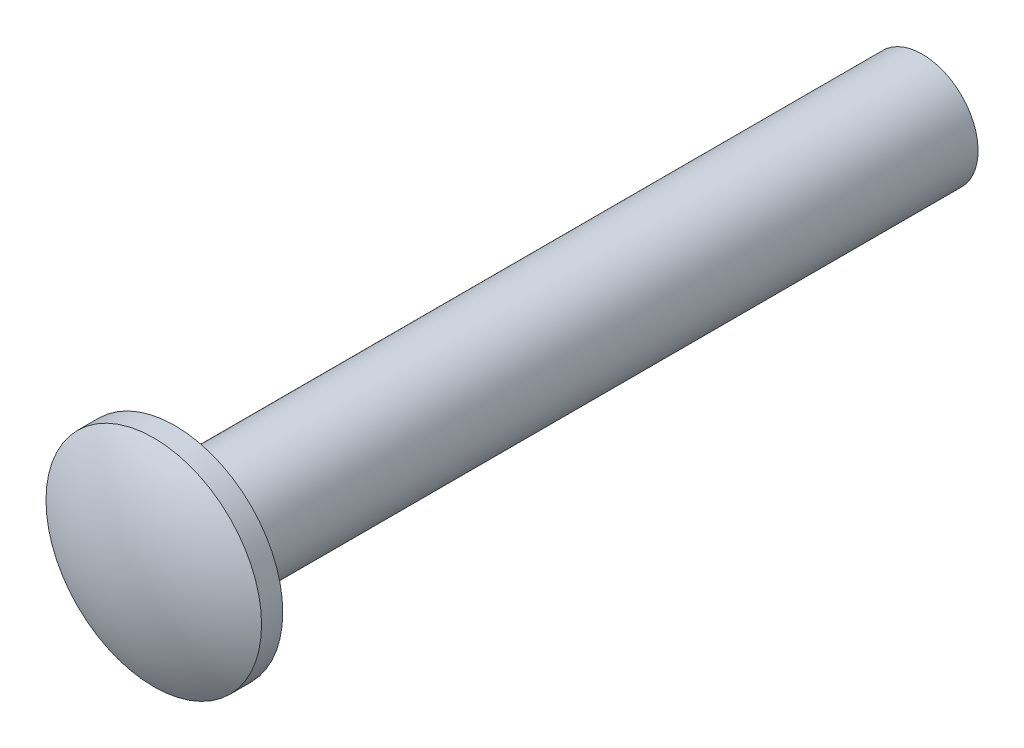
ISO-10303-21;
HEADER;
FILE_DESCRIPTION(('STEP AP214'),'2;1');
FILE_NAME('part.step','',(''),(''),'','','');
FILE_SCHEMA(('AUTOMOTIVE_DESIGN { 1 0 10303 214 1 1 1 1 }'));
ENDSEC;
DATA;
#1=APPLICATION_CONTEXT('core data for automotive mechanical design processes');
#2=APPLICATION_PROTOCOL_DEFINITION('international standard','automotive_design',2000,#1);
#3=PRODUCT_CONTEXT('',#1,'mechanical');
#4=PRODUCT('Part','Part','',(#3));
#5=PRODUCT_RELATED_PRODUCT_CATEGORY('part','',(#4));
#6=PRODUCT_DEFINITION_FORMATION('','',#4);
#7=PRODUCT_DEFINITION_CONTEXT('part definition',#1,'design');
#8=PRODUCT_DEFINITION('design','',#6,#7);
#9=PRODUCT_DEFINITION_SHAPE('','',#8);
#10=(LENGTH_UNIT() NAMED_UNIT(*) SI_UNIT(.MILLI.,.METRE.));
#11=(NAMED_UNIT(*) PLANE_ANGLE_UNIT() SI_UNIT($,.RADIAN.));
#12=(NAMED_UNIT(*) SI_UNIT($,.STERADIAN.) SOLID_ANGLE_UNIT());
#13=UNCERTAINTY_MEASURE_WITH_UNIT(LENGTH_MEASURE(1.E-05),#10,'distance_accuracy_value','');
#14=(GEOMETRIC_REPRESENTATION_CONTEXT(3) GLOBAL_UNCERTAINTY_ASSIGNED_CONTEXT((#13)) GLOBAL_UNIT_ASSIGNED_CONTEXT((#10,
#11,#12)) REPRESENTATION_CONTEXT('',''));
#15=CARTESIAN_POINT('',(0.,0.,0.));
#16=DIRECTION('',(0.,0.,1.));
#17=DIRECTION('',(1.,0.,0.));
#18=AXIS2_PLACEMENT_3D('',#15,#16,#17);
#19=CARTESIAN_POINT('',(0.,0.,0.9652));
#20=DIRECTION('',(0.,0.,-1.));
#21=DIRECTION('',(-1.,0.,0.));
#22=AXIS2_PLACEMENT_3D('',#19,#20,#21);
#23=CYLINDRICAL_SURFACE('',#22,4.90855);
#24=CARTESIAN_POINT('',(0.,0.,0.9652));
#25=DIRECTION('',(0.,0.,1.));
#26=DIRECTION('',(1.,0.,0.));
#27=AXIS2_PLACEMENT_3D('',#24,#25,#26);
#28=CIRCLE('',#27,4.90855);
#29=CARTESIAN_POINT('',(-4.90855,0.,0.9652));
#30=VERTEX_POINT('',#29);
#31=EDGE_CURVE('E36',#30,#30,#28,.T.);
#32=CARTESIAN_POINT('',(0.,0.,0.));
#33=DIRECTION('',(0.,0.,1.));
#34=DIRECTION('',(1.,0.,0.));
#35=AXIS2_PLACEMENT_3D('',#32,#33,#34);
#36=CIRCLE('',#35,4.90855);
#37=CARTESIAN_POINT('',(-4.90855,0.,0.));
#38=VERTEX_POINT('',#37);
#39=EDGE_CURVE('E44',#38,#38,#36,.T.);
#40=CARTESIAN_POINT('',(-4.90855,0.,0.9652));
#41=CARTESIAN_POINT('',(-4.90855,0.,0.955145833333333));
#42=CARTESIAN_POINT('',(-4.90855,0.,0.945091666666667));
#43=CARTESIAN_POINT('',(-4.90855,0.,0.924983333333333));
#44=CARTESIAN_POINT('',(-4.90855,0.,0.914929166666667));
#45=CARTESIAN_POINT('',(-4.90855,0.,0.894820833333333));
#46=CARTESIAN_POINT('',(-4.90855,0.,0.884766666666667));
#47=CARTESIAN_POINT('',(-4.90855,0.,0.864658333333333));
#48=CARTESIAN_POINT('',(-4.90855,0.,0.854604166666667));
#49=CARTESIAN_POINT('',(-4.90855,0.,0.834495833333333));
#50=CARTESIAN_POINT('',(-4.90855,0.,0.824441666666667));
#51=CARTESIAN_POINT('',(-4.90855,0.,0.804333333333333));
#52=CARTESIAN_POINT('',(-4.90855,0.,0.794279166666667));
#53=CARTESIAN_POINT('',(-4.90855,0.,0.774170833333333));
#54=CARTESIAN_POINT('',(-4.90855,0.,0.764116666666667));
#55=CARTESIAN_POINT('',(-4.90855,0.,0.744008333333333));
#56=CARTESIAN_POINT('',(-4.90855,0.,0.733954166666667));
#57=CARTESIAN_POINT('',(-4.90855,0.,0.713845833333333));
#58=CARTESIAN_POINT('',(-4.90855,0.,0.703791666666667));
#59=CARTESIAN_POINT('',(-4.90855,0.,0.683683333333333));
#60=CARTESIAN_POINT('',(-4.90855,0.,0.673629166666667));
#61=CARTESIAN_POINT('',(-4.90855,0.,0.653520833333333));
#62=CARTESIAN_POINT('',(-4.90855,0.,0.643466666666667));
#63=CARTESIAN_POINT('',(-4.90855,0.,0.623358333333333));
#64=CARTESIAN_POINT('',(-4.90855,0.,0.613304166666667));
#65=CARTESIAN_POINT('',(-4.90855,0.,0.593195833333333));
#66=CARTESIAN_POINT('',(-4.90855,0.,0.583141666666667));
#67=CARTESIAN_POINT('',(-4.90855,0.,0.563033333333333));
#68=CARTESIAN_POINT('',(-4.90855,0.,0.552979166666667));
#69=CARTESIAN_POINT('',(-4.90855,0.,0.532870833333333));
#70=CARTESIAN_POINT('',(-4.90855,0.,0.522816666666667));
#71=CARTESIAN_POINT('',(-4.90855,0.,0.502708333333333));
#72=CARTESIAN_POINT('',(-4.90855,0.,0.492654166666667));
#73=CARTESIAN_POINT('',(-4.90855,0.,0.472545833333333));
#74=CARTESIAN_POINT('',(-4.90855,0.,0.462491666666667));
#75=CARTESIAN_POINT('',(-4.90855,0.,0.442383333333333));
#76=CARTESIAN_POINT('',(-4.90855,0.,0.432329166666667));
#77=CARTESIAN_POINT('',(-4.90855,0.,0.412220833333333));
#78=CARTESIAN_POINT('',(-4.90855,0.,0.402166666666667));
#79=CARTESIAN_POINT('',(-4.90855,0.,0.382058333333333));
#80=CARTESIAN_POINT('',(-4.90855,0.,0.372004166666667));
#81=CARTESIAN_POINT('',(-4.90855,0.,0.351895833333333));
#82=CARTESIAN_POINT('',(-4.90855,0.,0.341841666666667));
#83=CARTESIAN_POINT('',(-4.90855,0.,0.321733333333333));
#84=CARTESIAN_POINT('',(-4.90855,0.,0.311679166666667));
#85=CARTESIAN_POINT('',(-4.90855,0.,0.291570833333333));
#86=CARTESIAN_POINT('',(-4.90855,0.,0.281516666666667));
#87=CARTESIAN_POINT('',(-4.90855,0.,0.261408333333333));
#88=CARTESIAN_POINT('',(-4.90855,0.,0.251354166666667));
#89=CARTESIAN_POINT('',(-4.90855,0.,0.231245833333333));
#90=CARTESIAN_POINT('',(-4.90855,0.,0.221191666666667));
#91=CARTESIAN_POINT('',(-4.90855,0.,0.201083333333333));
#92=CARTESIAN_POINT('',(-4.90855,0.,0.191029166666667));
#93=CARTESIAN_POINT('',(-4.90855,0.,0.170920833333333));
#94=CARTESIAN_POINT('',(-4.90855,0.,0.160866666666667));
#95=CARTESIAN_POINT('',(-4.90855,0.,0.140758333333333));
#96=CARTESIAN_POINT('',(-4.90855,0.,0.130704166666667));
#97=CARTESIAN_POINT('',(-4.90855,0.,0.110595833333333));
#98=CARTESIAN_POINT('',(-4.90855,0.,0.100541666666667));
#99=CARTESIAN_POINT('',(-4.90855,0.,0.0804333333333334));
#100=CARTESIAN_POINT('',(-4.90855,0.,0.0703791666666667));
#101=CARTESIAN_POINT('',(-4.90855,0.,0.0502708333333333));
#102=CARTESIAN_POINT('',(-4.90855,0.,0.0402166666666666));
#103=CARTESIAN_POINT('',(-4.90855,0.,0.0201083333333333));
#104=CARTESIAN_POINT('',(-4.90855,0.,0.0100541666666667));
#105=CARTESIAN_POINT('',(-4.90855,0.,0.));
#106=B_SPLINE_CURVE_WITH_KNOTS('',3,(#40,#41,#42,#43,#44,#45,#46,#47,#48,#49,#50,#51,#52,#53,
#54,#55,#56,#57,#58,#59,#60,#61,#62,#63,#64,#65,#66,#67,#68,#69,#70,#71,#72,#73,#74,#75,#76,#77,
#78,#79,#80,#81,#82,#83,#84,#85,#86,#87,#88,#89,#90,#91,#92,#93,#94,#95,#96,#97,#98,#99,#100,
#101,#102,#103,#104,#105),.UNSPECIFIED.,.F.,.F.,(4,2,2,2,2,2,2,2,2,2,2,2,2,2,2,2,2,2,2,2,2,2,2,
2,2,2,2,2,2,2,2,2,4),(0.,0.0301625000000001,0.0603250000000001,0.0904875000000001,0.12065,
0.1508125,0.180975,0.2111375,0.2413,0.2714625,0.301625,0.3317875,0.36195,0.3921125,0.422275,
0.4524375,0.4826,0.5127625,0.542925,0.5730875,0.60325,0.6334125,0.663575,0.6937375,0.7239,
0.7540625,0.784225,0.8143875,0.84455,0.8747125,0.904875,0.9350375,0.9652),.UNSPECIFIED.);
#107=EDGE_CURVE('BSEAM32',#30,#38,#106,.T.);
#108=ORIENTED_EDGE('',*,*,#31,.F.);
#109=ORIENTED_EDGE('',*,*,#39,.T.);
#110=ORIENTED_EDGE('',*,*,#107,.T.);
#111=ORIENTED_EDGE('',*,*,#107,.F.);
#112=EDGE_LOOP('',(#108,#110,#109,#111));
#113=FACE_BOUND('',#112,.T.);
#114=ADVANCED_FACE('F32',(#113),#23,.T.);
#115=CARTESIAN_POINT('',(0.,0.,-7.49533545673077));
#116=DIRECTION('',(0.,0.,1.));
#117=DIRECTION('',(1.,0.,0.));
#118=AXIS2_PLACEMENT_3D('',#115,#116,#117);
#119=SPHERICAL_SURFACE('',#118,9.78133545673077);
#120=ORIENTED_EDGE('',*,*,#31,.T.);
#121=EDGE_LOOP('',(#120));
#122=FACE_BOUND('',#121,.T.);
#123=ADVANCED_FACE('F34',(#122),#119,.T.);
#124=CARTESIAN_POINT('',(0.,0.,0.));
#125=DIRECTION('',(0.,0.,1.));
#126=DIRECTION('',(1.,0.,0.));
#127=AXIS2_PLACEMENT_3D('',#124,#125,#126);
#128=PLANE('',#127);
#129=CARTESIAN_POINT('',(0.,0.,0.));
#130=DIRECTION('',(0.,0.,-1.));
#131=DIRECTION('',(-1.,0.,0.));
#132=AXIS2_PLACEMENT_3D('',#129,#130,#131);
#133=CIRCLE('',#132,2.54);
#134=CARTESIAN_POINT('',(-2.54,0.,0.));
#135=VERTEX_POINT('',#134);
#136=EDGE_CURVE('E10',#135,#135,#133,.T.);
#137=ORIENTED_EDGE('',*,*,#136,.F.);
#138=EDGE_LOOP('',(#137));
#139=FACE_BOUND('',#138,.T.);
#140=ORIENTED_EDGE('',*,*,#39,.F.);
#141=EDGE_LOOP('',(#140));
#142=FACE_BOUND('',#141,.T.);
#143=ADVANCED_FACE('F57',(#139,#142),#128,.F.);
#144=CARTESIAN_POINT('',(0.,0.,-34.036));
#145=DIRECTION('',(0.,0.,1.));
#146=DIRECTION('',(1.,0.,0.));
#147=AXIS2_PLACEMENT_3D('',#144,#145,#146);
#148=CYLINDRICAL_SURFACE('',#147,2.54);
#149=CARTESIAN_POINT('',(0.,0.,-34.036));
#150=DIRECTION('',(0.,0.,-1.));
#151=DIRECTION('',(-1.,0.,0.));
#152=AXIS2_PLACEMENT_3D('',#149,#150,#151);
#153=CIRCLE('',#152,2.54);
#154=CARTESIAN_POINT('',(-2.54,0.,-34.036));
#155=VERTEX_POINT('',#154);
#156=EDGE_CURVE('E46',#155,#155,#153,.T.);
#157=ORIENTED_EDGE('',*,*,#156,.F.);
#158=EDGE_LOOP('',(#157));
#159=FACE_BOUND('',#158,.T.);
#160=ORIENTED_EDGE('',*,*,#136,.T.);
#161=EDGE_LOOP('',(#160));
#162=FACE_BOUND('',#161,.T.);
#163=ADVANCED_FACE('F55',(#159,#162),#148,.T.);
#164=CARTESIAN_POINT('',(0.,0.,-34.036));
#165=DIRECTION('',(0.,0.,-1.));
#166=DIRECTION('',(-1.,0.,0.));
#167=AXIS2_PLACEMENT_3D('',#164,#165,#166);
#168=PLANE('',#167);
#169=ORIENTED_EDGE('',*,*,#156,.T.);
#170=EDGE_LOOP('',(#169));
#171=FACE_BOUND('',#170,.T.);
#172=ADVANCED_FACE('F53',(#171),#168,.T.);
#173=CLOSED_SHELL('',(#114,#123,#143,#163,#172));
#174=MANIFOLD_SOLID_BREP('B2',#173);
#175=ADVANCED_BREP_SHAPE_REPRESENTATION('',(#18,#174),#14);
#176=SHAPE_DEFINITION_REPRESENTATION(#9,#175);
ENDSEC;
END-ISO-10303-21;
